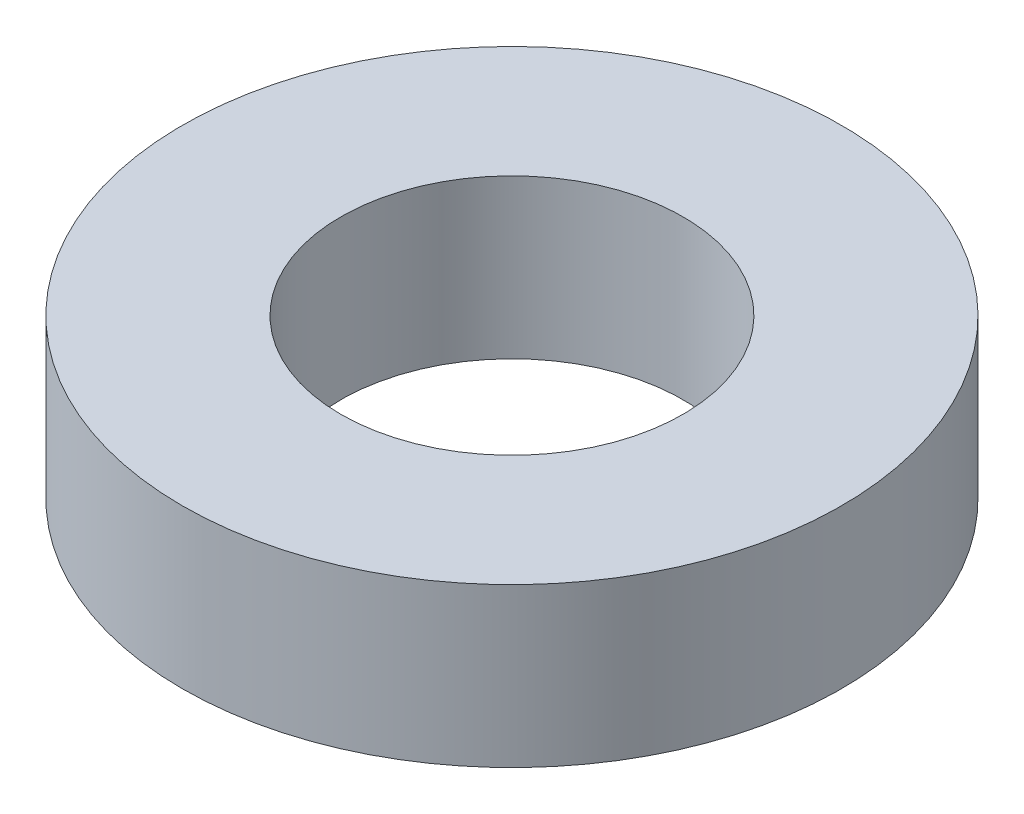
ISO-10303-21;
HEADER;
FILE_DESCRIPTION(('STEP AP214'),'2;1');
FILE_NAME('part.step','',(''),(''),'','','');
FILE_SCHEMA(('AUTOMOTIVE_DESIGN { 1 0 10303 214 1 1 1 1 }'));
ENDSEC;
DATA;
#1=APPLICATION_CONTEXT('core data for automotive mechanical design processes');
#2=APPLICATION_PROTOCOL_DEFINITION('international standard','automotive_design',2000,#1);
#3=PRODUCT_CONTEXT('',#1,'mechanical');
#4=PRODUCT('Part','Part','',(#3));
#5=PRODUCT_RELATED_PRODUCT_CATEGORY('part','',(#4));
#6=PRODUCT_DEFINITION_FORMATION('','',#4);
#7=PRODUCT_DEFINITION_CONTEXT('part definition',#1,'design');
#8=PRODUCT_DEFINITION('design','',#6,#7);
#9=PRODUCT_DEFINITION_SHAPE('','',#8);
#10=(LENGTH_UNIT() NAMED_UNIT(*) SI_UNIT(.MILLI.,.METRE.));
#11=(NAMED_UNIT(*) PLANE_ANGLE_UNIT() SI_UNIT($,.RADIAN.));
#12=(NAMED_UNIT(*) SI_UNIT($,.STERADIAN.) SOLID_ANGLE_UNIT());
#13=UNCERTAINTY_MEASURE_WITH_UNIT(LENGTH_MEASURE(1.E-05),#10,'distance_accuracy_value','');
#14=(GEOMETRIC_REPRESENTATION_CONTEXT(3) GLOBAL_UNCERTAINTY_ASSIGNED_CONTEXT((#13)) GLOBAL_UNIT_ASSIGNED_CONTEXT((#10,
#11,#12)) REPRESENTATION_CONTEXT('',''));
#15=CARTESIAN_POINT('',(0.,0.,0.));
#16=DIRECTION('',(0.,0.,1.));
#17=DIRECTION('',(1.,0.,0.));
#18=AXIS2_PLACEMENT_3D('',#15,#16,#17);
#19=CARTESIAN_POINT('',(0.,3.175,0.));
#20=DIRECTION('',(0.,1.,0.));
#21=DIRECTION('',(0.,0.,1.));
#22=AXIS2_PLACEMENT_3D('',#19,#20,#21);
#23=PLANE('',#22);
#24=CARTESIAN_POINT('',(0.,3.175,0.));
#25=DIRECTION('',(0.,1.,0.));
#26=DIRECTION('',(0.,0.,1.));
#27=AXIS2_PLACEMENT_3D('',#24,#25,#26);
#28=CIRCLE('',#27,6.604);
#29=CARTESIAN_POINT('',(0.,3.175,6.604));
#30=VERTEX_POINT('',#29);
#31=EDGE_CURVE('E10',#30,#30,#28,.T.);
#32=ORIENTED_EDGE('',*,*,#31,.T.);
#33=EDGE_LOOP('',(#32));
#34=FACE_BOUND('',#33,.T.);
#35=CARTESIAN_POINT('',(0.,3.175,0.));
#36=DIRECTION('',(0.,1.,0.));
#37=DIRECTION('',(0.,0.,1.));
#38=AXIS2_PLACEMENT_3D('',#35,#36,#37);
#39=CIRCLE('',#38,3.429);
#40=CARTESIAN_POINT('',(0.,3.175,3.429));
#41=VERTEX_POINT('',#40);
#42=EDGE_CURVE('E50',#41,#41,#39,.T.);
#43=ORIENTED_EDGE('',*,*,#42,.F.);
#44=EDGE_LOOP('',(#43));
#45=FACE_BOUND('',#44,.T.);
#46=ADVANCED_FACE('F37',(#34,#45),#23,.T.);
#47=CARTESIAN_POINT('',(0.,0.,0.));
#48=DIRECTION('',(0.,1.,0.));
#49=DIRECTION('',(0.,0.,1.));
#50=AXIS2_PLACEMENT_3D('',#47,#48,#49);
#51=PLANE('',#50);
#52=CARTESIAN_POINT('',(0.,0.,0.));
#53=DIRECTION('',(0.,1.,0.));
#54=DIRECTION('',(0.,0.,1.));
#55=AXIS2_PLACEMENT_3D('',#52,#53,#54);
#56=CIRCLE('',#55,6.604);
#57=CARTESIAN_POINT('',(0.,0.,6.604));
#58=VERTEX_POINT('',#57);
#59=EDGE_CURVE('E41',#58,#58,#56,.T.);
#60=ORIENTED_EDGE('',*,*,#59,.F.);
#61=EDGE_LOOP('',(#60));
#62=FACE_BOUND('',#61,.T.);
#63=CARTESIAN_POINT('',(0.,0.,0.));
#64=DIRECTION('',(0.,1.,0.));
#65=DIRECTION('',(0.,0.,1.));
#66=AXIS2_PLACEMENT_3D('',#63,#64,#65);
#67=CIRCLE('',#66,3.429);
#68=CARTESIAN_POINT('',(0.,0.,3.429));
#69=VERTEX_POINT('',#68);
#70=EDGE_CURVE('E52',#69,#69,#67,.T.);
#71=ORIENTED_EDGE('',*,*,#70,.T.);
#72=EDGE_LOOP('',(#71));
#73=FACE_BOUND('',#72,.T.);
#74=ADVANCED_FACE('F64',(#62,#73),#51,.F.);
#75=CARTESIAN_POINT('',(0.,3.175,0.));
#76=DIRECTION('',(0.,-1.,0.));
#77=DIRECTION('',(0.,0.,-1.));
#78=AXIS2_PLACEMENT_3D('',#75,#76,#77);
#79=CYLINDRICAL_SURFACE('',#78,6.604);
#80=ORIENTED_EDGE('',*,*,#31,.F.);
#81=EDGE_LOOP('',(#80));
#82=FACE_BOUND('',#81,.T.);
#83=ORIENTED_EDGE('',*,*,#59,.T.);
#84=EDGE_LOOP('',(#83));
#85=FACE_BOUND('',#84,.T.);
#86=ADVANCED_FACE('F39',(#82,#85),#79,.T.);
#87=CARTESIAN_POINT('',(0.,3.175,0.));
#88=DIRECTION('',(0.,-1.,0.));
#89=DIRECTION('',(0.,0.,-1.));
#90=AXIS2_PLACEMENT_3D('',#87,#88,#89);
#91=CYLINDRICAL_SURFACE('',#90,3.429);
#92=ORIENTED_EDGE('',*,*,#42,.T.);
#93=EDGE_LOOP('',(#92));
#94=FACE_BOUND('',#93,.T.);
#95=ORIENTED_EDGE('',*,*,#70,.F.);
#96=EDGE_LOOP('',(#95));
#97=FACE_BOUND('',#96,.T.);
#98=ADVANCED_FACE('F60',(#94,#97),#91,.F.);
#99=CLOSED_SHELL('',(#46,#74,#86,#98));
#100=MANIFOLD_SOLID_BREP('B2',#99);
#101=ADVANCED_BREP_SHAPE_REPRESENTATION('',(#18,#100),#14);
#102=SHAPE_DEFINITION_REPRESENTATION(#9,#101);
ENDSEC;
END-ISO-10303-21;
